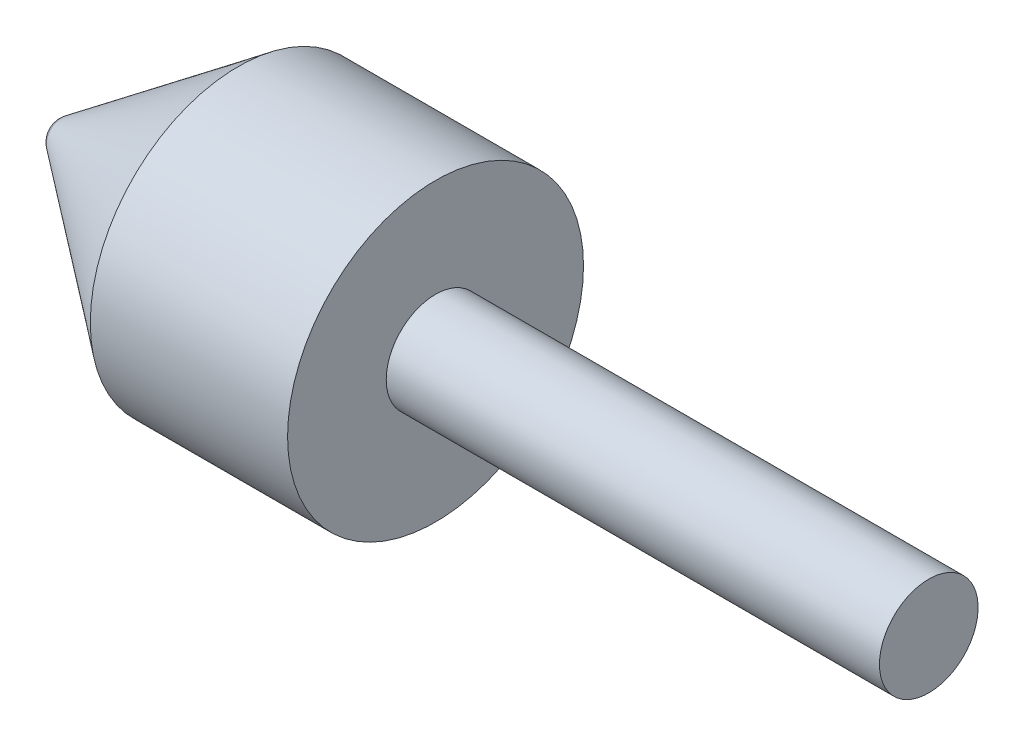
ISO-10303-21;
HEADER;
FILE_DESCRIPTION(('STEP AP214'),'2;1');
FILE_NAME('part.step','',(''),(''),'','','');
FILE_SCHEMA(('AUTOMOTIVE_DESIGN { 1 0 10303 214 1 1 1 1 }'));
ENDSEC;
DATA;
#1=APPLICATION_CONTEXT('core data for automotive mechanical design processes');
#2=APPLICATION_PROTOCOL_DEFINITION('international standard','automotive_design',2000,#1);
#3=PRODUCT_CONTEXT('',#1,'mechanical');
#4=PRODUCT('Part','Part','',(#3));
#5=PRODUCT_RELATED_PRODUCT_CATEGORY('part','',(#4));
#6=PRODUCT_DEFINITION_FORMATION('','',#4);
#7=PRODUCT_DEFINITION_CONTEXT('part definition',#1,'design');
#8=PRODUCT_DEFINITION('design','',#6,#7);
#9=PRODUCT_DEFINITION_SHAPE('','',#8);
#10=(LENGTH_UNIT() NAMED_UNIT(*) SI_UNIT(.MILLI.,.METRE.));
#11=(NAMED_UNIT(*) PLANE_ANGLE_UNIT() SI_UNIT($,.RADIAN.));
#12=(NAMED_UNIT(*) SI_UNIT($,.STERADIAN.) SOLID_ANGLE_UNIT());
#13=UNCERTAINTY_MEASURE_WITH_UNIT(LENGTH_MEASURE(1.E-05),#10,'distance_accuracy_value','');
#14=(GEOMETRIC_REPRESENTATION_CONTEXT(3) GLOBAL_UNCERTAINTY_ASSIGNED_CONTEXT((#13)) GLOBAL_UNIT_ASSIGNED_CONTEXT((#10,
#11,#12)) REPRESENTATION_CONTEXT('',''));
#15=CARTESIAN_POINT('',(0.,0.,0.));
#16=DIRECTION('',(0.,0.,1.));
#17=DIRECTION('',(1.,0.,0.));
#18=AXIS2_PLACEMENT_3D('',#15,#16,#17);
#19=CARTESIAN_POINT('',(-8.66666666666667,0.,0.));
#20=DIRECTION('',(-1.,0.,0.));
#21=DIRECTION('',(0.,1.,0.));
#22=AXIS2_PLACEMENT_3D('',#19,#20,#21);
#23=SPHERICAL_SURFACE('',#22,0.2);
#24=CARTESIAN_POINT('',(-8.78666666666667,0.,0.));
#25=DIRECTION('',(-1.,0.,0.));
#26=DIRECTION('',(0.,0.,1.));
#27=AXIS2_PLACEMENT_3D('',#24,#25,#26);
#28=CIRCLE('',#27,0.160000000000001);
#29=CARTESIAN_POINT('',(-8.78666666666667,0.,-0.160000000000002));
#30=VERTEX_POINT('',#29);
#31=EDGE_CURVE('E10',#30,#30,#28,.T.);
#32=ORIENTED_EDGE('',*,*,#31,.T.);
#33=EDGE_LOOP('',(#32));
#34=FACE_BOUND('',#33,.T.);
#35=ADVANCED_FACE('F38',(#34),#23,.T.);
#36=CARTESIAN_POINT('',(-7.,0.,0.));
#37=DIRECTION('',(1.,0.,0.));
#38=DIRECTION('',(0.,0.,-1.));
#39=AXIS2_PLACEMENT_3D('',#36,#37,#38);
#40=CONICAL_SURFACE('',#39,1.5,0.643501108793284);
#41=CARTESIAN_POINT('',(-7.,0.,0.));
#42=DIRECTION('',(-1.,0.,0.));
#43=DIRECTION('',(0.,0.,1.));
#44=AXIS2_PLACEMENT_3D('',#41,#42,#43);
#45=CIRCLE('',#44,1.5);
#46=CARTESIAN_POINT('',(-7.,0.,-1.5));
#47=VERTEX_POINT('',#46);
#48=EDGE_CURVE('E44',#47,#47,#45,.T.);
#49=CARTESIAN_POINT('',(-8.78666666666667,0.,-0.160000000000002));
#50=CARTESIAN_POINT('',(-8.76805555555555,0.,-0.173958333333335));
#51=CARTESIAN_POINT('',(-8.74944444444444,0.,-0.187916666666668));
#52=CARTESIAN_POINT('',(-8.71222222222222,0.,-0.215833333333335));
#53=CARTESIAN_POINT('',(-8.69361111111111,0.,-0.229791666666668));
#54=CARTESIAN_POINT('',(-8.65638888888889,0.,-0.257708333333335));
#55=CARTESIAN_POINT('',(-8.63777777777778,0.,-0.271666666666668));
#56=CARTESIAN_POINT('',(-8.60055555555555,0.,-0.299583333333335));
#57=CARTESIAN_POINT('',(-8.58194444444444,0.,-0.313541666666668));
#58=CARTESIAN_POINT('',(-8.54472222222222,0.,-0.341458333333335));
#59=CARTESIAN_POINT('',(-8.52611111111111,0.,-0.355416666666668));
#60=CARTESIAN_POINT('',(-8.48888888888889,0.,-0.383333333333335));
#61=CARTESIAN_POINT('',(-8.47027777777778,0.,-0.397291666666668));
#62=CARTESIAN_POINT('',(-8.43305555555555,0.,-0.425208333333335));
#63=CARTESIAN_POINT('',(-8.41444444444444,0.,-0.439166666666668));
#64=CARTESIAN_POINT('',(-8.37722222222222,0.,-0.467083333333335));
#65=CARTESIAN_POINT('',(-8.35861111111111,0.,-0.481041666666668));
#66=CARTESIAN_POINT('',(-8.32138888888889,0.,-0.508958333333335));
#67=CARTESIAN_POINT('',(-8.30277777777778,0.,-0.522916666666668));
#68=CARTESIAN_POINT('',(-8.26555555555555,0.,-0.550833333333334));
#69=CARTESIAN_POINT('',(-8.24694444444444,0.,-0.564791666666668));
#70=CARTESIAN_POINT('',(-8.20972222222222,0.,-0.592708333333335));
#71=CARTESIAN_POINT('',(-8.19111111111111,0.,-0.606666666666668));
#72=CARTESIAN_POINT('',(-8.15388888888889,0.,-0.634583333333334));
#73=CARTESIAN_POINT('',(-8.13527777777778,0.,-0.648541666666668));
#74=CARTESIAN_POINT('',(-8.09805555555555,0.,-0.676458333333334));
#75=CARTESIAN_POINT('',(-8.07944444444444,0.,-0.690416666666668));
#76=CARTESIAN_POINT('',(-8.04222222222222,0.,-0.718333333333334));
#77=CARTESIAN_POINT('',(-8.02361111111111,0.,-0.732291666666668));
#78=CARTESIAN_POINT('',(-7.98638888888889,0.,-0.760208333333334));
#79=CARTESIAN_POINT('',(-7.96777777777778,0.,-0.774166666666668));
#80=CARTESIAN_POINT('',(-7.93055555555556,0.,-0.802083333333334));
#81=CARTESIAN_POINT('',(-7.91194444444444,0.,-0.816041666666668));
#82=CARTESIAN_POINT('',(-7.87472222222222,0.,-0.843958333333334));
#83=CARTESIAN_POINT('',(-7.85611111111111,0.,-0.857916666666668));
#84=CARTESIAN_POINT('',(-7.81888888888889,0.,-0.885833333333334));
#85=CARTESIAN_POINT('',(-7.80027777777778,0.,-0.899791666666668));
#86=CARTESIAN_POINT('',(-7.76305555555555,0.,-0.927708333333334));
#87=CARTESIAN_POINT('',(-7.74444444444444,0.,-0.941666666666668));
#88=CARTESIAN_POINT('',(-7.70722222222222,0.,-0.969583333333334));
#89=CARTESIAN_POINT('',(-7.68861111111111,0.,-0.983541666666668));
#90=CARTESIAN_POINT('',(-7.65138888888889,0.,-1.01145833333333));
#91=CARTESIAN_POINT('',(-7.63277777777778,0.,-1.02541666666667));
#92=CARTESIAN_POINT('',(-7.59555555555556,0.,-1.05333333333333));
#93=CARTESIAN_POINT('',(-7.57694444444444,0.,-1.06729166666667));
#94=CARTESIAN_POINT('',(-7.53972222222222,0.,-1.09520833333333));
#95=CARTESIAN_POINT('',(-7.52111111111111,0.,-1.10916666666667));
#96=CARTESIAN_POINT('',(-7.48388888888889,0.,-1.13708333333333));
#97=CARTESIAN_POINT('',(-7.46527777777778,0.,-1.15104166666667));
#98=CARTESIAN_POINT('',(-7.42805555555555,0.,-1.17895833333333));
#99=CARTESIAN_POINT('',(-7.40944444444444,0.,-1.19291666666667));
#100=CARTESIAN_POINT('',(-7.37222222222222,0.,-1.22083333333333));
#101=CARTESIAN_POINT('',(-7.35361111111111,0.,-1.23479166666667));
#102=CARTESIAN_POINT('',(-7.31638888888889,0.,-1.26270833333333));
#103=CARTESIAN_POINT('',(-7.29777777777778,0.,-1.27666666666667));
#104=CARTESIAN_POINT('',(-7.26055555555556,0.,-1.30458333333333));
#105=CARTESIAN_POINT('',(-7.24194444444444,0.,-1.31854166666667));
#106=CARTESIAN_POINT('',(-7.20472222222222,0.,-1.34645833333333));
#107=CARTESIAN_POINT('',(-7.18611111111111,0.,-1.36041666666667));
#108=CARTESIAN_POINT('',(-7.14888888888889,0.,-1.38833333333333));
#109=CARTESIAN_POINT('',(-7.13027777777778,0.,-1.40229166666667));
#110=CARTESIAN_POINT('',(-7.09305555555556,0.,-1.43020833333333));
#111=CARTESIAN_POINT('',(-7.07444444444444,0.,-1.44416666666667));
#112=CARTESIAN_POINT('',(-7.03722222222222,0.,-1.47208333333333));
#113=CARTESIAN_POINT('',(-7.01861111111111,0.,-1.48604166666667));
#114=CARTESIAN_POINT('',(-7.,0.,-1.5));
#115=B_SPLINE_CURVE_WITH_KNOTS('',3,(#49,#50,#51,#52,#53,#54,#55,#56,#57,#58,#59,#60,#61,#62,
#63,#64,#65,#66,#67,#68,#69,#70,#71,#72,#73,#74,#75,#76,#77,#78,#79,#80,#81,#82,#83,#84,#85,#86,
#87,#88,#89,#90,#91,#92,#93,#94,#95,#96,#97,#98,#99,#100,#101,#102,#103,#104,#105,#106,#107,
#108,#109,#110,#111,#112,#113,#114),.UNSPECIFIED.,.F.,.F.,(4,2,2,2,2,2,2,2,2,2,2,2,2,2,2,2,2,2,
2,2,2,2,2,2,2,2,2,2,2,2,2,2,4),(0.,0.0697916666666663,0.139583333333333,0.209374999999999,
0.279166666666666,0.348958333333332,0.418749999999999,0.488541666666667,0.558333333333331,
0.628124999999999,0.697916666666666,0.767708333333332,0.837499999999999,0.907291666666665,
0.977083333333332,1.046875,1.11666666666667,1.18645833333333,1.25625,1.32604166666667,
1.39583333333333,1.465625,1.53541666666667,1.60520833333333,1.675,1.74479166666667,
1.81458333333333,1.884375,1.95416666666666,2.02395833333333,2.09375,2.16354166666666,
2.23333333333333),.UNSPECIFIED.);
#116=EDGE_CURVE('BSEAM73',#30,#47,#115,.T.);
#117=ORIENTED_EDGE('',*,*,#31,.F.);
#118=ORIENTED_EDGE('',*,*,#48,.T.);
#119=ORIENTED_EDGE('',*,*,#116,.T.);
#120=ORIENTED_EDGE('',*,*,#116,.F.);
#121=EDGE_LOOP('',(#117,#119,#118,#120));
#122=FACE_BOUND('',#121,.T.);
#123=ADVANCED_FACE('F73',(#122),#40,.T.);
#124=CARTESIAN_POINT('',(-8.86666666666667,0.,0.));
#125=DIRECTION('',(-1.,0.,0.));
#126=DIRECTION('',(0.,0.,1.));
#127=AXIS2_PLACEMENT_3D('',#124,#125,#126);
#128=CYLINDRICAL_SURFACE('',#127,1.5);
#129=ORIENTED_EDGE('',*,*,#48,.F.);
#130=EDGE_LOOP('',(#129));
#131=FACE_BOUND('',#130,.T.);
#132=CARTESIAN_POINT('',(-5.,0.,0.));
#133=DIRECTION('',(-1.,0.,0.));
#134=DIRECTION('',(0.,0.,1.));
#135=AXIS2_PLACEMENT_3D('',#132,#133,#134);
#136=CIRCLE('',#135,1.5);
#137=CARTESIAN_POINT('',(-5.,0.,1.5));
#138=VERTEX_POINT('',#137);
#139=EDGE_CURVE('E48',#138,#138,#136,.T.);
#140=ORIENTED_EDGE('',*,*,#139,.T.);
#141=EDGE_LOOP('',(#140));
#142=FACE_BOUND('',#141,.T.);
#143=ADVANCED_FACE('F77',(#131,#142),#128,.T.);
#144=CARTESIAN_POINT('',(-5.,0.5,0.));
#145=DIRECTION('',(-1.,0.,0.));
#146=DIRECTION('',(0.,0.,1.));
#147=AXIS2_PLACEMENT_3D('',#144,#145,#146);
#148=PLANE('',#147);
#149=ORIENTED_EDGE('',*,*,#139,.F.);
#150=EDGE_LOOP('',(#149));
#151=FACE_BOUND('',#150,.T.);
#152=CARTESIAN_POINT('',(-5.,0.,0.));
#153=DIRECTION('',(-1.,0.,0.));
#154=DIRECTION('',(0.,0.,1.));
#155=AXIS2_PLACEMENT_3D('',#152,#153,#154);
#156=CIRCLE('',#155,0.5);
#157=CARTESIAN_POINT('',(-5.,0.,0.5));
#158=VERTEX_POINT('',#157);
#159=EDGE_CURVE('E52',#158,#158,#156,.T.);
#160=ORIENTED_EDGE('',*,*,#159,.T.);
#161=EDGE_LOOP('',(#160));
#162=FACE_BOUND('',#161,.T.);
#163=ADVANCED_FACE('F69',(#151,#162),#148,.F.);
#164=CARTESIAN_POINT('',(-8.86666666666667,0.,0.));
#165=DIRECTION('',(-1.,0.,0.));
#166=DIRECTION('',(0.,0.,1.));
#167=AXIS2_PLACEMENT_3D('',#164,#165,#166);
#168=CYLINDRICAL_SURFACE('',#167,0.5);
#169=ORIENTED_EDGE('',*,*,#159,.F.);
#170=EDGE_LOOP('',(#169));
#171=FACE_BOUND('',#170,.T.);
#172=CARTESIAN_POINT('',(0.,0.,0.));
#173=DIRECTION('',(-1.,0.,0.));
#174=DIRECTION('',(0.,0.,1.));
#175=AXIS2_PLACEMENT_3D('',#172,#173,#174);
#176=CIRCLE('',#175,0.5);
#177=CARTESIAN_POINT('',(0.,0.,0.5));
#178=VERTEX_POINT('',#177);
#179=EDGE_CURVE('E57',#178,#178,#176,.T.);
#180=ORIENTED_EDGE('',*,*,#179,.T.);
#181=EDGE_LOOP('',(#180));
#182=FACE_BOUND('',#181,.T.);
#183=ADVANCED_FACE('F61',(#171,#182),#168,.T.);
#184=CARTESIAN_POINT('',(0.,0.,0.));
#185=DIRECTION('',(-1.,0.,0.));
#186=DIRECTION('',(0.,0.,1.));
#187=AXIS2_PLACEMENT_3D('',#184,#185,#186);
#188=PLANE('',#187);
#189=ORIENTED_EDGE('',*,*,#179,.F.);
#190=EDGE_LOOP('',(#189));
#191=FACE_BOUND('',#190,.T.);
#192=ADVANCED_FACE('F63',(#191),#188,.F.);
#193=CLOSED_SHELL('',(#35,#123,#143,#163,#183,#192));
#194=MANIFOLD_SOLID_BREP('B2',#193);
#195=ADVANCED_BREP_SHAPE_REPRESENTATION('',(#18,#194),#14);
#196=SHAPE_DEFINITION_REPRESENTATION(#9,#195);
ENDSEC;
END-ISO-10303-21;
